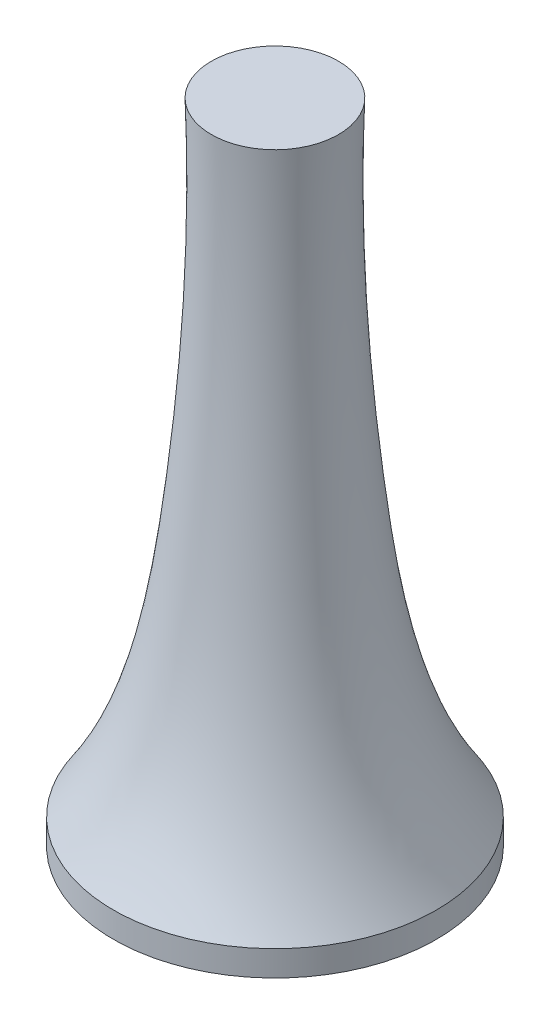
ISO-10303-21;
HEADER;
FILE_DESCRIPTION(('STEP AP214'),'2;1');
FILE_NAME('part.step','',(''),(''),'','','');
FILE_SCHEMA(('AUTOMOTIVE_DESIGN { 1 0 10303 214 1 1 1 1 }'));
ENDSEC;
DATA;
#1=APPLICATION_CONTEXT('core data for automotive mechanical design processes');
#2=APPLICATION_PROTOCOL_DEFINITION('international standard','automotive_design',2000,#1);
#3=PRODUCT_CONTEXT('',#1,'mechanical');
#4=PRODUCT('Part','Part','',(#3));
#5=PRODUCT_RELATED_PRODUCT_CATEGORY('part','',(#4));
#6=PRODUCT_DEFINITION_FORMATION('','',#4);
#7=PRODUCT_DEFINITION_CONTEXT('part definition',#1,'design');
#8=PRODUCT_DEFINITION('design','',#6,#7);
#9=PRODUCT_DEFINITION_SHAPE('','',#8);
#10=(LENGTH_UNIT() NAMED_UNIT(*) SI_UNIT(.MILLI.,.METRE.));
#11=(NAMED_UNIT(*) PLANE_ANGLE_UNIT() SI_UNIT($,.RADIAN.));
#12=(NAMED_UNIT(*) SI_UNIT($,.STERADIAN.) SOLID_ANGLE_UNIT());
#13=UNCERTAINTY_MEASURE_WITH_UNIT(LENGTH_MEASURE(1.E-05),#10,'distance_accuracy_value','');
#14=(GEOMETRIC_REPRESENTATION_CONTEXT(3) GLOBAL_UNCERTAINTY_ASSIGNED_CONTEXT((#13)) GLOBAL_UNIT_ASSIGNED_CONTEXT((#10,
#11,#12)) REPRESENTATION_CONTEXT('',''));
#15=CARTESIAN_POINT('',(0.,0.,0.));
#16=DIRECTION('',(0.,0.,1.));
#17=DIRECTION('',(1.,0.,0.));
#18=AXIS2_PLACEMENT_3D('',#15,#16,#17);
#19=CARTESIAN_POINT('',(0.,10.1920000122,0.));
#20=DIRECTION('',(0.,1.,0.));
#21=DIRECTION('',(0.,0.,1.));
#22=AXIS2_PLACEMENT_3D('',#19,#20,#21);
#23=PLANE('',#22);
#24=CARTESIAN_POINT('',(0.,10.1920000122,0.));
#25=DIRECTION('',(0.,-1.,0.));
#26=DIRECTION('',(0.,0.,-1.));
#27=AXIS2_PLACEMENT_3D('',#24,#25,#26);
#28=CIRCLE('',#27,1.);
#29=CARTESIAN_POINT('',(0.,10.1920000122,-1.));
#30=VERTEX_POINT('',#29);
#31=EDGE_CURVE('E10',#30,#30,#28,.T.);
#32=ORIENTED_EDGE('',*,*,#31,.F.);
#33=EDGE_LOOP('',(#32));
#34=FACE_BOUND('',#33,.T.);
#35=ADVANCED_FACE('F41',(#34),#23,.T.);
#36=CARTESIAN_POINT('',(2.54,0.4,0.));
#37=CARTESIAN_POINT('',(1.68141354786831,1.67271035131089,0.));
#38=CARTESIAN_POINT('',(1.10741625543052,5.01430649675046,0.));
#39=CARTESIAN_POINT('',(0.936252722921373,8.33873060216948,0.));
#40=CARTESIAN_POINT('',(1.,10.1920000122,0.));
#41=B_SPLINE_CURVE_WITH_KNOTS('',3,(#36,#37,#38,#39,#40),.UNSPECIFIED.,.F.,.F.,(4,1,4),(0.,
0.447040768123735,1.),.UNSPECIFIED.);
#42=CARTESIAN_POINT('',(0.,0.,0.));
#43=DIRECTION('',(0.,-1.,0.));
#44=AXIS1_PLACEMENT('',#42,#43);
#45=SURFACE_OF_REVOLUTION('',#41,#44);
#46=ORIENTED_EDGE('',*,*,#31,.T.);
#47=EDGE_LOOP('',(#46));
#48=FACE_BOUND('',#47,.T.);
#49=CARTESIAN_POINT('',(0.,0.4,0.));
#50=DIRECTION('',(0.,-1.,0.));
#51=DIRECTION('',(0.,0.,-1.));
#52=AXIS2_PLACEMENT_3D('',#49,#50,#51);
#53=CIRCLE('',#52,2.54);
#54=CARTESIAN_POINT('',(0.,0.4,-2.54));
#55=VERTEX_POINT('',#54);
#56=EDGE_CURVE('E48',#55,#55,#53,.T.);
#57=ORIENTED_EDGE('',*,*,#56,.F.);
#58=EDGE_LOOP('',(#57));
#59=FACE_BOUND('',#58,.T.);
#60=ADVANCED_FACE('F66',(#48,#59),#45,.F.);
#61=CARTESIAN_POINT('',(0.,0.,0.));
#62=DIRECTION('',(0.,-1.,0.));
#63=DIRECTION('',(0.,0.,-1.));
#64=AXIS2_PLACEMENT_3D('',#61,#62,#63);
#65=CYLINDRICAL_SURFACE('',#64,2.54);
#66=ORIENTED_EDGE('',*,*,#56,.T.);
#67=EDGE_LOOP('',(#66));
#68=FACE_BOUND('',#67,.T.);
#69=CARTESIAN_POINT('',(0.,0.,0.));
#70=DIRECTION('',(0.,-1.,0.));
#71=DIRECTION('',(0.,0.,-1.));
#72=AXIS2_PLACEMENT_3D('',#69,#70,#71);
#73=CIRCLE('',#72,2.54);
#74=CARTESIAN_POINT('',(0.,0.,-2.54));
#75=VERTEX_POINT('',#74);
#76=EDGE_CURVE('E53',#75,#75,#73,.T.);
#77=ORIENTED_EDGE('',*,*,#76,.F.);
#78=EDGE_LOOP('',(#77));
#79=FACE_BOUND('',#78,.T.);
#80=ADVANCED_FACE('F69',(#68,#79),#65,.T.);
#81=CARTESIAN_POINT('',(0.,0.,0.));
#82=DIRECTION('',(0.,-1.,0.));
#83=DIRECTION('',(0.,0.,-1.));
#84=AXIS2_PLACEMENT_3D('',#81,#82,#83);
#85=PLANE('',#84);
#86=ORIENTED_EDGE('',*,*,#76,.T.);
#87=EDGE_LOOP('',(#86));
#88=FACE_BOUND('',#87,.T.);
#89=ADVANCED_FACE('F72',(#88),#85,.T.);
#90=CLOSED_SHELL('',(#35,#60,#80,#89));
#91=MANIFOLD_SOLID_BREP('B2',#90);
#92=ADVANCED_BREP_SHAPE_REPRESENTATION('',(#18,#91),#14);
#93=SHAPE_DEFINITION_REPRESENTATION(#9,#92);
ENDSEC;
END-ISO-10303-21;
